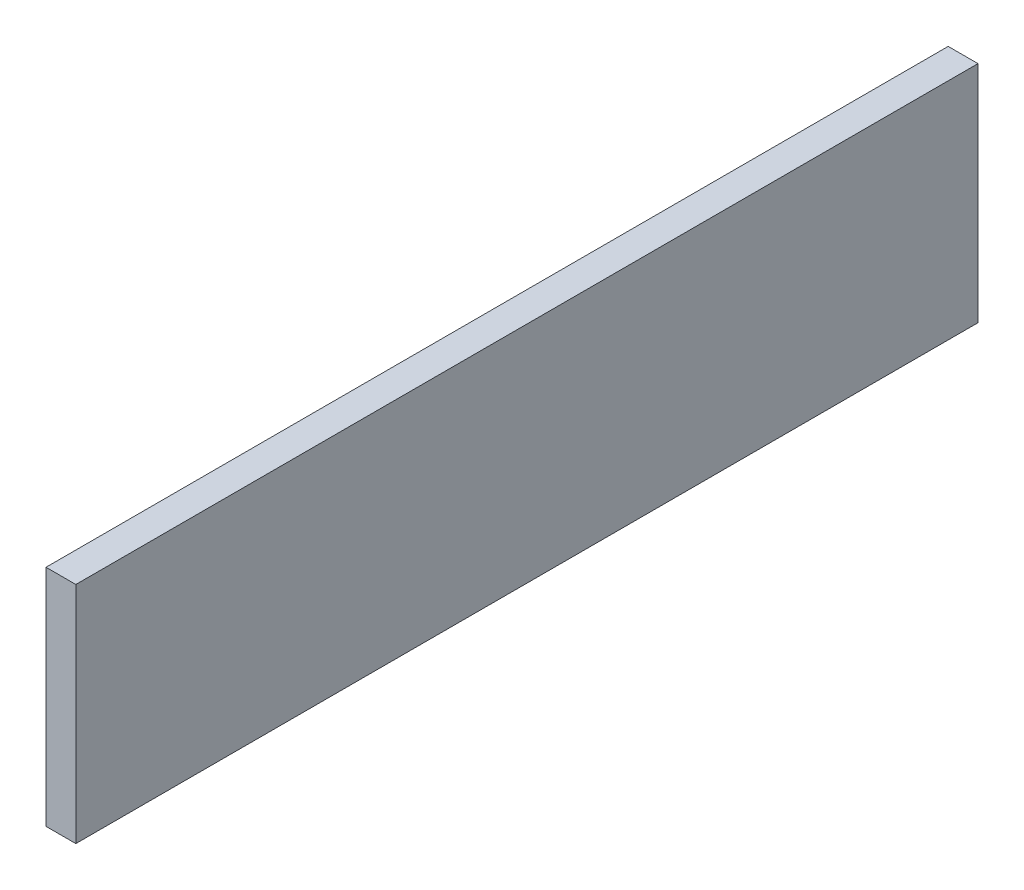
ISO-10303-21;
HEADER;
FILE_DESCRIPTION(('STEP AP214'),'2;1');
FILE_NAME('part.step','',(''),(''),'','','');
FILE_SCHEMA(('AUTOMOTIVE_DESIGN { 1 0 10303 214 1 1 1 1 }'));
ENDSEC;
DATA;
#1=APPLICATION_CONTEXT('core data for automotive mechanical design processes');
#2=APPLICATION_PROTOCOL_DEFINITION('international standard','automotive_design',2000,#1);
#3=PRODUCT_CONTEXT('',#1,'mechanical');
#4=PRODUCT('Part','Part','',(#3));
#5=PRODUCT_RELATED_PRODUCT_CATEGORY('part','',(#4));
#6=PRODUCT_DEFINITION_FORMATION('','',#4);
#7=PRODUCT_DEFINITION_CONTEXT('part definition',#1,'design');
#8=PRODUCT_DEFINITION('design','',#6,#7);
#9=PRODUCT_DEFINITION_SHAPE('','',#8);
#10=(LENGTH_UNIT() NAMED_UNIT(*) SI_UNIT(.MILLI.,.METRE.));
#11=(NAMED_UNIT(*) PLANE_ANGLE_UNIT() SI_UNIT($,.RADIAN.));
#12=(NAMED_UNIT(*) SI_UNIT($,.STERADIAN.) SOLID_ANGLE_UNIT());
#13=UNCERTAINTY_MEASURE_WITH_UNIT(LENGTH_MEASURE(1.E-05),#10,'distance_accuracy_value','');
#14=(GEOMETRIC_REPRESENTATION_CONTEXT(3) GLOBAL_UNCERTAINTY_ASSIGNED_CONTEXT((#13)) GLOBAL_UNIT_ASSIGNED_CONTEXT((#10,
#11,#12)) REPRESENTATION_CONTEXT('',''));
#15=CARTESIAN_POINT('',(0.,0.,0.));
#16=DIRECTION('',(0.,0.,1.));
#17=DIRECTION('',(1.,0.,0.));
#18=AXIS2_PLACEMENT_3D('',#15,#16,#17);
#19=CARTESIAN_POINT('',(20.25,12.25,-20.25));
#20=DIRECTION('',(-1.,0.,0.));
#21=DIRECTION('',(0.,0.,1.));
#22=AXIS2_PLACEMENT_3D('',#19,#20,#21);
#23=PLANE('',#22);
#24=DIRECTION('',(0.,0.,1.));
#25=VECTOR('',#24,1.);
#26=CARTESIAN_POINT('',(20.25,22.05,0.));
#27=LINE('',#26,#25);
#28=CARTESIAN_POINT('',(20.25,22.05,-30.2499999999999));
#29=VERTEX_POINT('',#28);
#30=CARTESIAN_POINT('',(20.25,22.05,30.2500000000001));
#31=VERTEX_POINT('',#30);
#32=EDGE_CURVE('E92',#29,#31,#27,.T.);
#33=ORIENTED_EDGE('',*,*,#32,.F.);
#34=DIRECTION('',(0.,1.,0.));
#35=VECTOR('',#34,1.);
#36=CARTESIAN_POINT('',(20.25,-68.1032622460571,-30.2499999999999));
#37=LINE('',#36,#35);
#38=CARTESIAN_POINT('',(20.25,7.00000000000001,-30.2499999999999));
#39=VERTEX_POINT('',#38);
#40=EDGE_CURVE('E94',#39,#29,#37,.T.);
#41=ORIENTED_EDGE('',*,*,#40,.F.);
#42=DIRECTION('',(0.,0.,-1.));
#43=VECTOR('',#42,1.);
#44=CARTESIAN_POINT('',(20.25,7.,45.0629667643682));
#45=LINE('',#44,#43);
#46=CARTESIAN_POINT('',(20.25,7.00000000000001,30.2500000000001));
#47=VERTEX_POINT('',#46);
#48=EDGE_CURVE('E102',#47,#39,#45,.T.);
#49=ORIENTED_EDGE('',*,*,#48,.F.);
#50=DIRECTION('',(0.,-1.,0.));
#51=VECTOR('',#50,1.);
#52=CARTESIAN_POINT('',(20.25,-68.1032622460571,30.2500000000001));
#53=LINE('',#52,#51);
#54=EDGE_CURVE('E49',#31,#47,#53,.T.);
#55=ORIENTED_EDGE('',*,*,#54,.F.);
#56=EDGE_LOOP('',(#33,#41,#49,#55));
#57=FACE_BOUND('',#56,.T.);
#58=ADVANCED_FACE('F45',(#57),#23,.T.);
#59=CARTESIAN_POINT('',(0.,22.05,0.));
#60=DIRECTION('',(0.,-1.,0.));
#61=DIRECTION('',(0.,0.,-1.));
#62=AXIS2_PLACEMENT_3D('',#59,#60,#61);
#63=PLANE('',#62);
#64=ORIENTED_EDGE('',*,*,#32,.T.);
#65=DIRECTION('',(1.,0.,0.));
#66=VECTOR('',#65,1.);
#67=CARTESIAN_POINT('',(-22.2500000000003,22.05,30.2500000000001));
#68=LINE('',#67,#66);
#69=CARTESIAN_POINT('',(22.25,22.05,30.2500000000001));
#70=VERTEX_POINT('',#69);
#71=EDGE_CURVE('E104',#31,#70,#68,.T.);
#72=ORIENTED_EDGE('',*,*,#71,.T.);
#73=DIRECTION('',(0.,0.,-1.));
#74=VECTOR('',#73,1.);
#75=CARTESIAN_POINT('',(22.25,22.05,30.2500000000001));
#76=LINE('',#75,#74);
#77=CARTESIAN_POINT('',(22.25,22.05,-30.2499999999999));
#78=VERTEX_POINT('',#77);
#79=EDGE_CURVE('E11',#70,#78,#76,.T.);
#80=ORIENTED_EDGE('',*,*,#79,.T.);
#81=DIRECTION('',(-1.,0.,0.));
#82=VECTOR('',#81,1.);
#83=CARTESIAN_POINT('',(-22.2500000000003,22.05,-30.2499999999999));
#84=LINE('',#83,#82);
#85=EDGE_CURVE('E55',#78,#29,#84,.T.);
#86=ORIENTED_EDGE('',*,*,#85,.T.);
#87=EDGE_LOOP('',(#64,#72,#80,#86));
#88=FACE_BOUND('',#87,.T.);
#89=ADVANCED_FACE('F103',(#88),#63,.F.);
#90=CARTESIAN_POINT('',(-12.,7.,45.0629667643682));
#91=DIRECTION('',(0.,-1.,0.));
#92=DIRECTION('',(0.,0.,-1.));
#93=AXIS2_PLACEMENT_3D('',#90,#91,#92);
#94=PLANE('',#93);
#95=DIRECTION('',(1.,0.,0.));
#96=VECTOR('',#95,1.);
#97=CARTESIAN_POINT('',(-22.2500000000003,7.00000000000001,30.2500000000001));
#98=LINE('',#97,#96);
#99=CARTESIAN_POINT('',(22.25,7.00000000000001,30.2500000000001));
#100=VERTEX_POINT('',#99);
#101=EDGE_CURVE('E64',#47,#100,#98,.T.);
#102=ORIENTED_EDGE('',*,*,#101,.F.);
#103=ORIENTED_EDGE('',*,*,#48,.T.);
#104=DIRECTION('',(-1.,0.,0.));
#105=VECTOR('',#104,1.);
#106=CARTESIAN_POINT('',(-22.2500000000003,7.00000000000001,-30.2499999999999));
#107=LINE('',#106,#105);
#108=CARTESIAN_POINT('',(22.25,7.00000000000001,-30.2499999999999));
#109=VERTEX_POINT('',#108);
#110=EDGE_CURVE('E101',#109,#39,#107,.T.);
#111=ORIENTED_EDGE('',*,*,#110,.F.);
#112=DIRECTION('',(0.,0.,-1.));
#113=VECTOR('',#112,1.);
#114=CARTESIAN_POINT('',(22.25,7.00000000000001,30.2500000000001));
#115=LINE('',#114,#113);
#116=EDGE_CURVE('E114',#100,#109,#115,.T.);
#117=ORIENTED_EDGE('',*,*,#116,.F.);
#118=EDGE_LOOP('',(#102,#103,#111,#117));
#119=FACE_BOUND('',#118,.T.);
#120=ADVANCED_FACE('F113',(#119),#94,.T.);
#121=CARTESIAN_POINT('',(-22.2500000000003,-68.1032622460571,-30.2499999999999));
#122=DIRECTION('',(0.,0.,-1.));
#123=DIRECTION('',(0.,1.,0.));
#124=AXIS2_PLACEMENT_3D('',#121,#122,#123);
#125=PLANE('',#124);
#126=ORIENTED_EDGE('',*,*,#110,.T.);
#127=ORIENTED_EDGE('',*,*,#40,.T.);
#128=ORIENTED_EDGE('',*,*,#85,.F.);
#129=DIRECTION('',(0.,1.,0.));
#130=VECTOR('',#129,1.);
#131=CARTESIAN_POINT('',(22.25,-68.1032622460571,-30.2499999999999));
#132=LINE('',#131,#130);
#133=EDGE_CURVE('E76',#109,#78,#132,.T.);
#134=ORIENTED_EDGE('',*,*,#133,.F.);
#135=EDGE_LOOP('',(#126,#127,#128,#134));
#136=FACE_BOUND('',#135,.T.);
#137=ADVANCED_FACE('F47',(#136),#125,.T.);
#138=CARTESIAN_POINT('',(-22.2500000000003,-68.1032622460571,30.2500000000001));
#139=DIRECTION('',(0.,0.,1.));
#140=DIRECTION('',(0.,-1.,0.));
#141=AXIS2_PLACEMENT_3D('',#138,#139,#140);
#142=PLANE('',#141);
#143=ORIENTED_EDGE('',*,*,#71,.F.);
#144=ORIENTED_EDGE('',*,*,#54,.T.);
#145=ORIENTED_EDGE('',*,*,#101,.T.);
#146=DIRECTION('',(0.,1.,0.));
#147=VECTOR('',#146,1.);
#148=CARTESIAN_POINT('',(22.25,-68.1032622460571,30.2500000000001));
#149=LINE('',#148,#147);
#150=EDGE_CURVE('E111',#100,#70,#149,.T.);
#151=ORIENTED_EDGE('',*,*,#150,.T.);
#152=EDGE_LOOP('',(#143,#144,#145,#151));
#153=FACE_BOUND('',#152,.T.);
#154=ADVANCED_FACE('F119',(#153),#142,.T.);
#155=CARTESIAN_POINT('',(22.25,-68.1032622460571,30.2500000000001));
#156=DIRECTION('',(1.,0.,0.));
#157=DIRECTION('',(0.,0.,-1.));
#158=AXIS2_PLACEMENT_3D('',#155,#156,#157);
#159=PLANE('',#158);
#160=ORIENTED_EDGE('',*,*,#150,.F.);
#161=ORIENTED_EDGE('',*,*,#116,.T.);
#162=ORIENTED_EDGE('',*,*,#133,.T.);
#163=ORIENTED_EDGE('',*,*,#79,.F.);
#164=EDGE_LOOP('',(#160,#161,#162,#163));
#165=FACE_BOUND('',#164,.T.);
#166=ADVANCED_FACE('F116',(#165),#159,.T.);
#167=CLOSED_SHELL('',(#58,#89,#120,#137,#154,#166));
#168=MANIFOLD_SOLID_BREP('B2',#167);
#169=ADVANCED_BREP_SHAPE_REPRESENTATION('',(#18,#168),#14);
#170=SHAPE_DEFINITION_REPRESENTATION(#9,#169);
ENDSEC;
END-ISO-10303-21;
